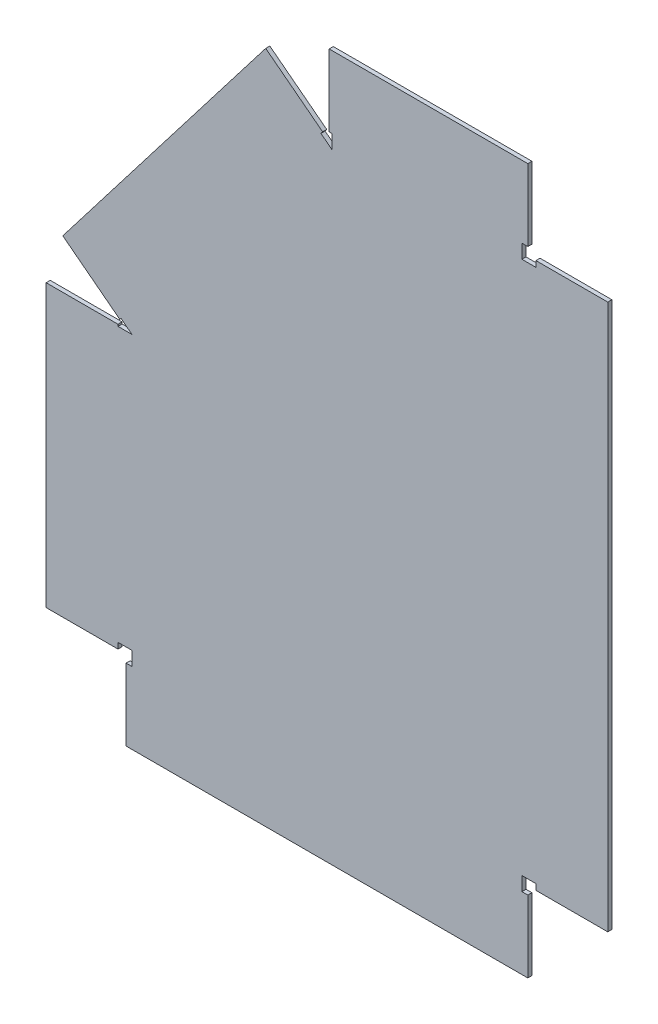
ISO-10303-21;
HEADER;
FILE_DESCRIPTION(('STEP AP214'),'2;1');
FILE_NAME('part.step','',(''),(''),'','','');
FILE_SCHEMA(('AUTOMOTIVE_DESIGN { 1 0 10303 214 1 1 1 1 }'));
ENDSEC;
DATA;
#1=APPLICATION_CONTEXT('core data for automotive mechanical design processes');
#2=APPLICATION_PROTOCOL_DEFINITION('international standard','automotive_design',2000,#1);
#3=PRODUCT_CONTEXT('',#1,'mechanical');
#4=PRODUCT('Part','Part','',(#3));
#5=PRODUCT_RELATED_PRODUCT_CATEGORY('part','',(#4));
#6=PRODUCT_DEFINITION_FORMATION('','',#4);
#7=PRODUCT_DEFINITION_CONTEXT('part definition',#1,'design');
#8=PRODUCT_DEFINITION('design','',#6,#7);
#9=PRODUCT_DEFINITION_SHAPE('','',#8);
#10=(LENGTH_UNIT() NAMED_UNIT(*) SI_UNIT(.MILLI.,.METRE.));
#11=(NAMED_UNIT(*) PLANE_ANGLE_UNIT() SI_UNIT($,.RADIAN.));
#12=(NAMED_UNIT(*) SI_UNIT($,.STERADIAN.) SOLID_ANGLE_UNIT());
#13=UNCERTAINTY_MEASURE_WITH_UNIT(LENGTH_MEASURE(1.E-05),#10,'distance_accuracy_value','');
#14=(GEOMETRIC_REPRESENTATION_CONTEXT(3) GLOBAL_UNCERTAINTY_ASSIGNED_CONTEXT((#13)) GLOBAL_UNIT_ASSIGNED_CONTEXT((#10,
#11,#12)) REPRESENTATION_CONTEXT('',''));
#15=CARTESIAN_POINT('',(0.,0.,0.));
#16=DIRECTION('',(0.,0.,1.));
#17=DIRECTION('',(1.,0.,0.));
#18=AXIS2_PLACEMENT_3D('',#15,#16,#17);
#19=CARTESIAN_POINT('',(0.,2.49999999999999,325.81995012622));
#20=DIRECTION('',(0.,-1.,0.));
#21=DIRECTION('',(0.,0.,-1.));
#22=AXIS2_PLACEMENT_3D('',#19,#20,#21);
#23=PLANE('',#22);
#24=DIRECTION('',(0.,0.,-1.));
#25=VECTOR('',#24,1.);
#26=CARTESIAN_POINT('',(-2.49999999999999,2.49999999999999,325.81995012622));
#27=LINE('',#26,#25);
#28=CARTESIAN_POINT('',(-2.49999999999999,2.49999999999999,1.));
#29=VERTEX_POINT('',#28);
#30=CARTESIAN_POINT('',(-2.49999999999999,2.49999999999999,0.));
#31=VERTEX_POINT('',#30);
#32=EDGE_CURVE('E279',#29,#31,#27,.T.);
#33=ORIENTED_EDGE('',*,*,#32,.T.);
#34=DIRECTION('',(-1.,0.,0.));
#35=VECTOR('',#34,1.);
#36=CARTESIAN_POINT('',(0.,2.49999999999999,0.));
#37=LINE('',#36,#35);
#38=CARTESIAN_POINT('',(0.899999999999991,2.49999999999999,0.));
#39=VERTEX_POINT('',#38);
#40=EDGE_CURVE('E62',#39,#31,#37,.T.);
#41=ORIENTED_EDGE('',*,*,#40,.F.);
#42=DIRECTION('',(0.,0.,-1.));
#43=VECTOR('',#42,1.);
#44=CARTESIAN_POINT('',(0.899999999999975,2.49999999999999,269.144751350765));
#45=LINE('',#44,#43);
#46=CARTESIAN_POINT('',(0.899999999999991,2.49999999999999,1.));
#47=VERTEX_POINT('',#46);
#48=EDGE_CURVE('E463',#47,#39,#45,.T.);
#49=ORIENTED_EDGE('',*,*,#48,.F.);
#50=DIRECTION('',(-1.,0.,0.));
#51=VECTOR('',#50,1.);
#52=CARTESIAN_POINT('',(0.,2.49999999999999,1.));
#53=LINE('',#52,#51);
#54=EDGE_CURVE('E283',#47,#29,#53,.T.);
#55=ORIENTED_EDGE('',*,*,#54,.T.);
#56=EDGE_LOOP('',(#33,#41,#49,#55));
#57=FACE_BOUND('',#56,.T.);
#58=ADVANCED_FACE('F47',(#57),#23,.T.);
#59=CARTESIAN_POINT('',(0.,132.5,325.81995012622));
#60=DIRECTION('',(0.,1.,0.));
#61=DIRECTION('',(0.,0.,1.));
#62=AXIS2_PLACEMENT_3D('',#59,#60,#61);
#63=PLANE('',#62);
#64=DIRECTION('',(1.,0.,0.));
#65=VECTOR('',#64,1.);
#66=CARTESIAN_POINT('',(0.,132.5,1.));
#67=LINE('',#66,#65);
#68=CARTESIAN_POINT('',(-2.49999999999999,132.5,1.));
#69=VERTEX_POINT('',#68);
#70=CARTESIAN_POINT('',(0.89999999999999,132.5,1.));
#71=VERTEX_POINT('',#70);
#72=EDGE_CURVE('E506',#69,#71,#67,.T.);
#73=ORIENTED_EDGE('',*,*,#72,.T.);
#74=DIRECTION('',(0.,0.,-1.));
#75=VECTOR('',#74,1.);
#76=CARTESIAN_POINT('',(0.899999999999973,132.5,269.144751350765));
#77=LINE('',#76,#75);
#78=CARTESIAN_POINT('',(0.89999999999999,132.5,0.));
#79=VERTEX_POINT('',#78);
#80=EDGE_CURVE('E444',#71,#79,#77,.T.);
#81=ORIENTED_EDGE('',*,*,#80,.T.);
#82=DIRECTION('',(1.,0.,0.));
#83=VECTOR('',#82,1.);
#84=CARTESIAN_POINT('',(0.,132.5,0.));
#85=LINE('',#84,#83);
#86=CARTESIAN_POINT('',(-2.49999999999999,132.5,0.));
#87=VERTEX_POINT('',#86);
#88=EDGE_CURVE('E489',#87,#79,#85,.T.);
#89=ORIENTED_EDGE('',*,*,#88,.F.);
#90=DIRECTION('',(0.,0.,-1.));
#91=VECTOR('',#90,1.);
#92=CARTESIAN_POINT('',(-2.49999999999999,132.5,325.81995012622));
#93=LINE('',#92,#91);
#94=EDGE_CURVE('E12',#69,#87,#93,.T.);
#95=ORIENTED_EDGE('',*,*,#94,.F.);
#96=EDGE_LOOP('',(#73,#81,#89,#95));
#97=FACE_BOUND('',#96,.T.);
#98=ADVANCED_FACE('F562',(#97),#63,.T.);
#99=CARTESIAN_POINT('',(-2.49999999999999,0.,325.81995012622));
#100=DIRECTION('',(1.,0.,0.));
#101=DIRECTION('',(0.,0.,-1.));
#102=AXIS2_PLACEMENT_3D('',#99,#100,#101);
#103=PLANE('',#102);
#104=ORIENTED_EDGE('',*,*,#94,.T.);
#105=DIRECTION('',(0.,-1.,0.));
#106=VECTOR('',#105,1.);
#107=CARTESIAN_POINT('',(-2.49999999999999,0.,0.));
#108=LINE('',#107,#106);
#109=CARTESIAN_POINT('',(-2.49999999999999,135.9,0.));
#110=VERTEX_POINT('',#109);
#111=EDGE_CURVE('E447',#110,#87,#108,.T.);
#112=ORIENTED_EDGE('',*,*,#111,.F.);
#113=DIRECTION('',(0.,0.,-1.));
#114=VECTOR('',#113,1.);
#115=CARTESIAN_POINT('',(-2.49999999999999,135.9,104.242165006645));
#116=LINE('',#115,#114);
#117=CARTESIAN_POINT('',(-2.49999999999999,135.9,1.));
#118=VERTEX_POINT('',#117);
#119=EDGE_CURVE('E418',#118,#110,#116,.T.);
#120=ORIENTED_EDGE('',*,*,#119,.F.);
#121=DIRECTION('',(0.,-1.,0.));
#122=VECTOR('',#121,1.);
#123=CARTESIAN_POINT('',(-2.49999999999999,0.,1.));
#124=LINE('',#123,#122);
#125=EDGE_CURVE('E69',#118,#69,#124,.T.);
#126=ORIENTED_EDGE('',*,*,#125,.T.);
#127=EDGE_LOOP('',(#104,#112,#120,#126));
#128=FACE_BOUND('',#127,.T.);
#129=ADVANCED_FACE('F558',(#128),#103,.T.);
#130=CARTESIAN_POINT('',(-48.7689962563738,0.,325.81995012622));
#131=DIRECTION('',(-1.,0.,0.));
#132=DIRECTION('',(0.,0.,1.));
#133=AXIS2_PLACEMENT_3D('',#130,#131,#132);
#134=PLANE('',#133);
#135=DIRECTION('',(0.,1.,0.));
#136=VECTOR('',#135,1.);
#137=CARTESIAN_POINT('',(-48.7689962563738,0.,1.));
#138=LINE('',#137,#136);
#139=CARTESIAN_POINT('',(-48.7689962563738,132.5,1.));
#140=VERTEX_POINT('',#139);
#141=CARTESIAN_POINT('',(-48.7689962563738,135.9,1.));
#142=VERTEX_POINT('',#141);
#143=EDGE_CURVE('E509',#140,#142,#138,.T.);
#144=ORIENTED_EDGE('',*,*,#143,.T.);
#145=DIRECTION('',(0.,0.,-1.));
#146=VECTOR('',#145,1.);
#147=CARTESIAN_POINT('',(-48.7689962563738,135.9,104.242165006645));
#148=LINE('',#147,#146);
#149=CARTESIAN_POINT('',(-48.7689962563738,135.9,0.));
#150=VERTEX_POINT('',#149);
#151=EDGE_CURVE('E397',#142,#150,#148,.T.);
#152=ORIENTED_EDGE('',*,*,#151,.T.);
#153=DIRECTION('',(0.,1.,0.));
#154=VECTOR('',#153,1.);
#155=CARTESIAN_POINT('',(-48.7689962563738,0.,0.));
#156=LINE('',#155,#154);
#157=CARTESIAN_POINT('',(-48.7689962563738,132.5,0.));
#158=VERTEX_POINT('',#157);
#159=EDGE_CURVE('E504',#158,#150,#156,.T.);
#160=ORIENTED_EDGE('',*,*,#159,.F.);
#161=DIRECTION('',(0.,0.,-1.));
#162=VECTOR('',#161,1.);
#163=CARTESIAN_POINT('',(-48.7689962563738,132.5,325.81995012622));
#164=LINE('',#163,#162);
#165=EDGE_CURVE('E55',#140,#158,#164,.T.);
#166=ORIENTED_EDGE('',*,*,#165,.F.);
#167=EDGE_LOOP('',(#144,#152,#160,#166));
#168=FACE_BOUND('',#167,.T.);
#169=ADVANCED_FACE('F536',(#168),#134,.T.);
#170=CARTESIAN_POINT('',(45.9037188638016,59.6748345229422,325.81995012622));
#171=DIRECTION('',(0.609710760849692,0.792623989104601,0.));
#172=DIRECTION('',(-0.792623989104601,0.609710760849692,0.));
#173=AXIS2_PLACEMENT_3D('',#170,#171,#172);
#174=PLANE('',#173);
#175=ORIENTED_EDGE('',*,*,#165,.T.);
#176=DIRECTION('',(0.792623989104601,-0.609710760849692,0.));
#177=VECTOR('',#176,1.);
#178=CARTESIAN_POINT('',(45.9037188638016,59.6748345229422,0.));
#179=LINE('',#178,#177);
#180=CARTESIAN_POINT('',(-51.4639178193294,134.573016586889,0.));
#181=VERTEX_POINT('',#180);
#182=EDGE_CURVE('E502',#181,#158,#179,.T.);
#183=ORIENTED_EDGE('',*,*,#182,.F.);
#184=DIRECTION('',(0.,0.,-1.));
#185=VECTOR('',#184,1.);
#186=CARTESIAN_POINT('',(-51.4639178193294,134.573016586889,197.164597398797));
#187=LINE('',#186,#185);
#188=CARTESIAN_POINT('',(-51.4639178193294,134.573016586889,1.));
#189=VERTEX_POINT('',#188);
#190=EDGE_CURVE('E374',#189,#181,#187,.T.);
#191=ORIENTED_EDGE('',*,*,#190,.F.);
#192=DIRECTION('',(0.792623989104601,-0.609710760849692,0.));
#193=VECTOR('',#192,1.);
#194=CARTESIAN_POINT('',(45.9037188638016,59.6748345229422,1.));
#195=LINE('',#194,#193);
#196=EDGE_CURVE('E511',#189,#140,#195,.T.);
#197=ORIENTED_EDGE('',*,*,#196,.T.);
#198=EDGE_LOOP('',(#175,#183,#191,#197));
#199=FACE_BOUND('',#198,.T.);
#200=ADVANCED_FACE('F530',(#199),#174,.T.);
#201=CARTESIAN_POINT('',(-2.82728487982477,-3.67547034377219,325.81995012622));
#202=DIRECTION('',(-0.609710760849693,-0.7926239891046,0.));
#203=DIRECTION('',(0.7926239891046,-0.609710760849693,0.));
#204=AXIS2_PLACEMENT_3D('',#201,#202,#203);
#205=PLANE('',#204);
#206=DIRECTION('',(-0.7926239891046,0.609710760849693,0.));
#207=VECTOR('',#206,1.);
#208=CARTESIAN_POINT('',(-2.82728487982477,-3.67547034377219,1.));
#209=LINE('',#208,#207);
#210=CARTESIAN_POINT('',(-97.5,69.1496951332858,1.));
#211=VERTEX_POINT('',#210);
#212=CARTESIAN_POINT('',(-100.194921562956,71.2227117201747,0.999999999999945));
#213=VERTEX_POINT('',#212);
#214=EDGE_CURVE('E513',#211,#213,#209,.T.);
#215=ORIENTED_EDGE('',*,*,#214,.T.);
#216=DIRECTION('',(0.,0.,-1.));
#217=VECTOR('',#216,1.);
#218=CARTESIAN_POINT('',(-100.194921562956,71.2227117201746,197.164597398797));
#219=LINE('',#218,#217);
#220=CARTESIAN_POINT('',(-100.194921562956,71.2227117201747,0.));
#221=VERTEX_POINT('',#220);
#222=EDGE_CURVE('E350',#213,#221,#219,.T.);
#223=ORIENTED_EDGE('',*,*,#222,.T.);
#224=DIRECTION('',(-0.7926239891046,0.609710760849693,0.));
#225=VECTOR('',#224,1.);
#226=CARTESIAN_POINT('',(-2.82728487982477,-3.67547034377219,0.));
#227=LINE('',#226,#225);
#228=CARTESIAN_POINT('',(-97.5,69.1496951332858,0.));
#229=VERTEX_POINT('',#228);
#230=EDGE_CURVE('E500',#229,#221,#227,.T.);
#231=ORIENTED_EDGE('',*,*,#230,.F.);
#232=DIRECTION('',(0.,0.,-1.));
#233=VECTOR('',#232,1.);
#234=CARTESIAN_POINT('',(-97.5,69.1496951332858,325.81995012622));
#235=LINE('',#234,#233);
#236=EDGE_CURVE('E525',#211,#229,#235,.T.);
#237=ORIENTED_EDGE('',*,*,#236,.F.);
#238=EDGE_LOOP('',(#215,#223,#231,#237));
#239=FACE_BOUND('',#238,.T.);
#240=ADVANCED_FACE('F596',(#239),#205,.T.);
#241=CARTESIAN_POINT('',(0.,69.1496951332858,325.81995012622));
#242=DIRECTION('',(0.,1.,0.));
#243=DIRECTION('',(0.,0.,1.));
#244=AXIS2_PLACEMENT_3D('',#241,#242,#243);
#245=PLANE('',#244);
#246=ORIENTED_EDGE('',*,*,#236,.T.);
#247=DIRECTION('',(1.,0.,0.));
#248=VECTOR('',#247,1.);
#249=CARTESIAN_POINT('',(0.,69.1496951332858,0.));
#250=LINE('',#249,#248);
#251=CARTESIAN_POINT('',(-100.9,69.1496951332858,0.));
#252=VERTEX_POINT('',#251);
#253=EDGE_CURVE('E498',#252,#229,#250,.T.);
#254=ORIENTED_EDGE('',*,*,#253,.F.);
#255=DIRECTION('',(0.,0.,-1.));
#256=VECTOR('',#255,1.);
#257=CARTESIAN_POINT('',(-100.9,69.1496951332858,142.721302256771));
#258=LINE('',#257,#256);
#259=CARTESIAN_POINT('',(-100.9,69.1496951332858,1.));
#260=VERTEX_POINT('',#259);
#261=EDGE_CURVE('E328',#260,#252,#258,.T.);
#262=ORIENTED_EDGE('',*,*,#261,.F.);
#263=DIRECTION('',(1.,0.,0.));
#264=VECTOR('',#263,1.);
#265=CARTESIAN_POINT('',(0.,69.1496951332858,1.));
#266=LINE('',#265,#264);
#267=EDGE_CURVE('E515',#260,#211,#266,.T.);
#268=ORIENTED_EDGE('',*,*,#267,.T.);
#269=EDGE_LOOP('',(#246,#254,#262,#268));
#270=FACE_BOUND('',#269,.T.);
#271=ADVANCED_FACE('F599',(#270),#245,.T.);
#272=CARTESIAN_POINT('',(0.,2.49999999999999,325.81995012622));
#273=DIRECTION('',(0.,-1.,0.));
#274=DIRECTION('',(0.,0.,-1.));
#275=AXIS2_PLACEMENT_3D('',#272,#273,#274);
#276=PLANE('',#275);
#277=DIRECTION('',(-1.,0.,0.));
#278=VECTOR('',#277,1.);
#279=CARTESIAN_POINT('',(0.,2.49999999999999,1.));
#280=LINE('',#279,#278);
#281=CARTESIAN_POINT('',(-97.5,2.49999999999999,1.));
#282=VERTEX_POINT('',#281);
#283=CARTESIAN_POINT('',(-100.9,2.49999999999999,1.));
#284=VERTEX_POINT('',#283);
#285=EDGE_CURVE('E517',#282,#284,#280,.T.);
#286=ORIENTED_EDGE('',*,*,#285,.T.);
#287=DIRECTION('',(0.,0.,-1.));
#288=VECTOR('',#287,1.);
#289=CARTESIAN_POINT('',(-100.9,2.49999999999999,142.721302256771));
#290=LINE('',#289,#288);
#291=CARTESIAN_POINT('',(-100.9,2.49999999999999,0.));
#292=VERTEX_POINT('',#291);
#293=EDGE_CURVE('E305',#284,#292,#290,.T.);
#294=ORIENTED_EDGE('',*,*,#293,.T.);
#295=DIRECTION('',(-1.,0.,0.));
#296=VECTOR('',#295,1.);
#297=CARTESIAN_POINT('',(0.,2.49999999999999,0.));
#298=LINE('',#297,#296);
#299=CARTESIAN_POINT('',(-97.5,2.49999999999999,0.));
#300=VERTEX_POINT('',#299);
#301=EDGE_CURVE('E496',#300,#292,#298,.T.);
#302=ORIENTED_EDGE('',*,*,#301,.F.);
#303=DIRECTION('',(0.,0.,-1.));
#304=VECTOR('',#303,1.);
#305=CARTESIAN_POINT('',(-97.5,2.49999999999999,325.81995012622));
#306=LINE('',#305,#304);
#307=EDGE_CURVE('E522',#282,#300,#306,.T.);
#308=ORIENTED_EDGE('',*,*,#307,.F.);
#309=EDGE_LOOP('',(#286,#294,#302,#308));
#310=FACE_BOUND('',#309,.T.);
#311=ADVANCED_FACE('F603',(#310),#276,.T.);
#312=CARTESIAN_POINT('',(-97.5,0.,325.81995012622));
#313=DIRECTION('',(-1.,0.,0.));
#314=DIRECTION('',(0.,0.,1.));
#315=AXIS2_PLACEMENT_3D('',#312,#313,#314);
#316=PLANE('',#315);
#317=ORIENTED_EDGE('',*,*,#307,.T.);
#318=DIRECTION('',(0.,1.,0.));
#319=VECTOR('',#318,1.);
#320=CARTESIAN_POINT('',(-97.5,0.,0.));
#321=LINE('',#320,#319);
#322=CARTESIAN_POINT('',(-97.5,-0.899999999999991,0.));
#323=VERTEX_POINT('',#322);
#324=EDGE_CURVE('E494',#323,#300,#321,.T.);
#325=ORIENTED_EDGE('',*,*,#324,.F.);
#326=DIRECTION('',(0.,0.,-1.));
#327=VECTOR('',#326,1.);
#328=CARTESIAN_POINT('',(-97.5,-0.899999999999979,200.000516724731));
#329=LINE('',#328,#327);
#330=CARTESIAN_POINT('',(-97.5,-0.899999999999991,1.));
#331=VERTEX_POINT('',#330);
#332=EDGE_CURVE('E1126',#331,#323,#329,.T.);
#333=ORIENTED_EDGE('',*,*,#332,.F.);
#334=DIRECTION('',(0.,1.,0.));
#335=VECTOR('',#334,1.);
#336=CARTESIAN_POINT('',(-97.5,0.,1.));
#337=LINE('',#336,#335);
#338=EDGE_CURVE('E284',#331,#282,#337,.T.);
#339=ORIENTED_EDGE('',*,*,#338,.T.);
#340=EDGE_LOOP('',(#317,#325,#333,#339));
#341=FACE_BOUND('',#340,.T.);
#342=ADVANCED_FACE('F607',(#341),#316,.T.);
#343=CARTESIAN_POINT('',(-2.49999999999999,0.,325.81995012622));
#344=DIRECTION('',(1.,0.,0.));
#345=DIRECTION('',(0.,0.,-1.));
#346=AXIS2_PLACEMENT_3D('',#343,#344,#345);
#347=PLANE('',#346);
#348=DIRECTION('',(0.,-1.,0.));
#349=VECTOR('',#348,1.);
#350=CARTESIAN_POINT('',(-2.49999999999999,0.,1.));
#351=LINE('',#350,#349);
#352=CARTESIAN_POINT('',(-2.49999999999999,-0.899999999999991,1.));
#353=VERTEX_POINT('',#352);
#354=EDGE_CURVE('E274',#29,#353,#351,.T.);
#355=ORIENTED_EDGE('',*,*,#354,.T.);
#356=DIRECTION('',(0.,0.,-1.));
#357=VECTOR('',#356,1.);
#358=CARTESIAN_POINT('',(-2.49999999999999,-0.899999999999979,200.000516724731));
#359=LINE('',#358,#357);
#360=CARTESIAN_POINT('',(-2.49999999999999,-0.899999999999991,0.));
#361=VERTEX_POINT('',#360);
#362=EDGE_CURVE('E277',#353,#361,#359,.T.);
#363=ORIENTED_EDGE('',*,*,#362,.T.);
#364=DIRECTION('',(0.,-1.,0.));
#365=VECTOR('',#364,1.);
#366=CARTESIAN_POINT('',(-2.49999999999999,0.,0.));
#367=LINE('',#366,#365);
#368=EDGE_CURVE('E492',#31,#361,#367,.T.);
#369=ORIENTED_EDGE('',*,*,#368,.F.);
#370=ORIENTED_EDGE('',*,*,#32,.F.);
#371=EDGE_LOOP('',(#355,#363,#369,#370));
#372=FACE_BOUND('',#371,.T.);
#373=ADVANCED_FACE('F276',(#372),#347,.T.);
#374=CARTESIAN_POINT('',(0.,0.,1.));
#375=DIRECTION('',(0.,0.,-1.));
#376=DIRECTION('',(-1.,0.,0.));
#377=AXIS2_PLACEMENT_3D('',#374,#375,#376);
#378=PLANE('',#377);
#379=ORIENTED_EDGE('',*,*,#54,.F.);
#380=DIRECTION('',(0.,1.,0.));
#381=VECTOR('',#380,1.);
#382=CARTESIAN_POINT('',(0.899999999999989,135.,1.));
#383=LINE('',#382,#381);
#384=CARTESIAN_POINT('',(0.899999999999993,1.07071067811865,1.));
#385=VERTEX_POINT('',#384);
#386=EDGE_CURVE('E466',#385,#47,#383,.T.);
#387=ORIENTED_EDGE('',*,*,#386,.F.);
#388=DIRECTION('',(1.,0.,0.));
#389=VECTOR('',#388,1.);
#390=CARTESIAN_POINT('',(18.4,1.07071067811865,1.));
#391=LINE('',#390,#389);
#392=CARTESIAN_POINT('',(18.4,1.07071067811865,1.));
#393=VERTEX_POINT('',#392);
#394=EDGE_CURVE('E460',#385,#393,#391,.T.);
#395=ORIENTED_EDGE('',*,*,#394,.T.);
#396=DIRECTION('',(0.,1.,0.));
#397=VECTOR('',#396,1.);
#398=CARTESIAN_POINT('',(18.4,0.,1.));
#399=LINE('',#398,#397);
#400=CARTESIAN_POINT('',(18.4,133.929289321881,1.));
#401=VERTEX_POINT('',#400);
#402=EDGE_CURVE('E457',#393,#401,#399,.T.);
#403=ORIENTED_EDGE('',*,*,#402,.T.);
#404=DIRECTION('',(-1.,0.,0.));
#405=VECTOR('',#404,1.);
#406=CARTESIAN_POINT('',(18.4,133.929289321881,1.));
#407=LINE('',#406,#405);
#408=CARTESIAN_POINT('',(0.899999999999989,133.929289321881,1.));
#409=VERTEX_POINT('',#408);
#410=EDGE_CURVE('E454',#401,#409,#407,.T.);
#411=ORIENTED_EDGE('',*,*,#410,.T.);
#412=DIRECTION('',(0.,1.,0.));
#413=VECTOR('',#412,1.);
#414=CARTESIAN_POINT('',(0.899999999999989,135.,1.));
#415=LINE('',#414,#413);
#416=EDGE_CURVE('E400',#71,#409,#415,.T.);
#417=ORIENTED_EDGE('',*,*,#416,.F.);
#418=ORIENTED_EDGE('',*,*,#72,.F.);
#419=ORIENTED_EDGE('',*,*,#125,.F.);
#420=DIRECTION('',(-1.,0.,0.));
#421=VECTOR('',#420,1.);
#422=CARTESIAN_POINT('',(-50.,135.9,1.));
#423=LINE('',#422,#421);
#424=CARTESIAN_POINT('',(-1.07071067811866,135.9,1.));
#425=VERTEX_POINT('',#424);
#426=EDGE_CURVE('E421',#425,#118,#423,.T.);
#427=ORIENTED_EDGE('',*,*,#426,.F.);
#428=DIRECTION('',(0.,1.,0.));
#429=VECTOR('',#428,1.);
#430=CARTESIAN_POINT('',(-1.07071067811865,153.4,1.));
#431=LINE('',#430,#429);
#432=CARTESIAN_POINT('',(-1.07071067811866,153.4,1.));
#433=VERTEX_POINT('',#432);
#434=EDGE_CURVE('E415',#425,#433,#431,.T.);
#435=ORIENTED_EDGE('',*,*,#434,.T.);
#436=DIRECTION('',(-1.,0.,0.));
#437=VECTOR('',#436,1.);
#438=CARTESIAN_POINT('',(0.,153.4,1.));
#439=LINE('',#438,#437);
#440=CARTESIAN_POINT('',(-49.45186567482,153.4,1.));
#441=VERTEX_POINT('',#440);
#442=EDGE_CURVE('E412',#433,#441,#439,.T.);
#443=ORIENTED_EDGE('',*,*,#442,.T.);
#444=DIRECTION('',(0.,-1.,0.));
#445=VECTOR('',#444,1.);
#446=CARTESIAN_POINT('',(-49.45186567482,153.4,1.));
#447=LINE('',#446,#445);
#448=CARTESIAN_POINT('',(-49.45186567482,135.9,1.));
#449=VERTEX_POINT('',#448);
#450=EDGE_CURVE('E409',#441,#449,#447,.T.);
#451=ORIENTED_EDGE('',*,*,#450,.T.);
#452=DIRECTION('',(1.,0.,0.));
#453=VECTOR('',#452,1.);
#454=CARTESIAN_POINT('',(-50.,135.9,1.));
#455=LINE('',#454,#453);
#456=EDGE_CURVE('E406',#449,#142,#455,.T.);
#457=ORIENTED_EDGE('',*,*,#456,.T.);
#458=ORIENTED_EDGE('',*,*,#143,.F.);
#459=ORIENTED_EDGE('',*,*,#196,.F.);
#460=DIRECTION('',(0.609710760849692,0.792623989104601,0.));
#461=VECTOR('',#460,1.);
#462=CARTESIAN_POINT('',(-100.713361590194,70.5487396847647,0.999999999999973));
#463=LINE('',#462,#461);
#464=CARTESIAN_POINT('',(-51.0475649866475,135.114275269375,0.999999999999973));
#465=VERTEX_POINT('',#464);
#466=EDGE_CURVE('E368',#189,#465,#463,.T.);
#467=ORIENTED_EDGE('',*,*,#466,.T.);
#468=DIRECTION('',(-0.792623989104601,0.609710760849692,0.));
#469=VECTOR('',#468,1.);
#470=CARTESIAN_POINT('',(-64.918484795978,145.784213584245,1.));
#471=LINE('',#470,#469);
#472=CARTESIAN_POINT('',(-64.918484795978,145.784213584245,0.999999999999987));
#473=VERTEX_POINT('',#472);
#474=EDGE_CURVE('E365',#465,#473,#471,.T.);
#475=ORIENTED_EDGE('',*,*,#474,.T.);
#476=DIRECTION('',(-0.609710760849692,-0.792623989104601,0.));
#477=VECTOR('',#476,1.);
#478=CARTESIAN_POINT('',(-111.238556492461,85.5681203788165,0.999999999999973));
#479=LINE('',#478,#477);
#480=CARTESIAN_POINT('',(-114.344704766671,81.5301276223436,0.999999999999959));
#481=VERTEX_POINT('',#480);
#482=EDGE_CURVE('E362',#473,#481,#479,.T.);
#483=ORIENTED_EDGE('',*,*,#482,.T.);
#484=DIRECTION('',(0.792623989104601,-0.609710760849692,0.));
#485=VECTOR('',#484,1.);
#486=CARTESIAN_POINT('',(-114.344704766671,81.5301276223436,0.999999999999945));
#487=LINE('',#486,#485);
#488=CARTESIAN_POINT('',(-100.473784957341,70.860189307474,0.999999999999973));
#489=VERTEX_POINT('',#488);
#490=EDGE_CURVE('E359',#481,#489,#487,.T.);
#491=ORIENTED_EDGE('',*,*,#490,.T.);
#492=DIRECTION('',(0.609710760849692,0.792623989104601,0.));
#493=VECTOR('',#492,1.);
#494=CARTESIAN_POINT('',(-100.713361590194,70.5487396847647,0.999999999999973));
#495=LINE('',#494,#493);
#496=EDGE_CURVE('E356',#489,#213,#495,.T.);
#497=ORIENTED_EDGE('',*,*,#496,.T.);
#498=ORIENTED_EDGE('',*,*,#214,.F.);
#499=ORIENTED_EDGE('',*,*,#267,.F.);
#500=DIRECTION('',(0.,1.,0.));
#501=VECTOR('',#500,1.);
#502=CARTESIAN_POINT('',(-100.9,0.,1.));
#503=LINE('',#502,#501);
#504=CARTESIAN_POINT('',(-100.9,69.6070651065442,1.));
#505=VERTEX_POINT('',#504);
#506=EDGE_CURVE('E322',#260,#505,#503,.T.);
#507=ORIENTED_EDGE('',*,*,#506,.T.);
#508=DIRECTION('',(-1.,0.,0.));
#509=VECTOR('',#508,1.);
#510=CARTESIAN_POINT('',(-118.4,69.6070651065442,0.999999999999987));
#511=LINE('',#510,#509);
#512=CARTESIAN_POINT('',(-118.4,69.6070651065442,0.999999999999987));
#513=VERTEX_POINT('',#512);
#514=EDGE_CURVE('E319',#505,#513,#511,.T.);
#515=ORIENTED_EDGE('',*,*,#514,.T.);
#516=DIRECTION('',(0.,-1.,0.));
#517=VECTOR('',#516,1.);
#518=CARTESIAN_POINT('',(-118.4,0.,0.999999999999987));
#519=LINE('',#518,#517);
#520=CARTESIAN_POINT('',(-118.4,1.07071067811865,0.999999999999987));
#521=VERTEX_POINT('',#520);
#522=EDGE_CURVE('E316',#513,#521,#519,.T.);
#523=ORIENTED_EDGE('',*,*,#522,.T.);
#524=DIRECTION('',(1.,0.,0.));
#525=VECTOR('',#524,1.);
#526=CARTESIAN_POINT('',(-118.4,1.07071067811865,0.999999999999987));
#527=LINE('',#526,#525);
#528=CARTESIAN_POINT('',(-100.9,1.07071067811865,1.));
#529=VERTEX_POINT('',#528);
#530=EDGE_CURVE('E313',#521,#529,#527,.T.);
#531=ORIENTED_EDGE('',*,*,#530,.T.);
#532=DIRECTION('',(0.,-1.,0.));
#533=VECTOR('',#532,1.);
#534=CARTESIAN_POINT('',(-100.9,0.,1.));
#535=LINE('',#534,#533);
#536=EDGE_CURVE('E293',#284,#529,#535,.T.);
#537=ORIENTED_EDGE('',*,*,#536,.F.);
#538=ORIENTED_EDGE('',*,*,#285,.F.);
#539=ORIENTED_EDGE('',*,*,#338,.F.);
#540=DIRECTION('',(1.,0.,0.));
#541=VECTOR('',#540,1.);
#542=CARTESIAN_POINT('',(0.,-0.89999999999999,1.));
#543=LINE('',#542,#541);
#544=CARTESIAN_POINT('',(-98.9292893218813,-0.899999999999993,1.));
#545=VERTEX_POINT('',#544);
#546=EDGE_CURVE('E1123',#545,#331,#543,.T.);
#547=ORIENTED_EDGE('',*,*,#546,.F.);
#548=DIRECTION('',(0.,-1.,0.));
#549=VECTOR('',#548,1.);
#550=CARTESIAN_POINT('',(-98.9292893218813,-18.4,1.));
#551=LINE('',#550,#549);
#552=CARTESIAN_POINT('',(-98.9292893218813,-18.4,1.));
#553=VERTEX_POINT('',#552);
#554=EDGE_CURVE('E1129',#545,#553,#551,.T.);
#555=ORIENTED_EDGE('',*,*,#554,.T.);
#556=DIRECTION('',(1.,0.,0.));
#557=VECTOR('',#556,1.);
#558=CARTESIAN_POINT('',(0.,-18.4,1.));
#559=LINE('',#558,#557);
#560=CARTESIAN_POINT('',(-1.07071067811865,-18.4,1.));
#561=VERTEX_POINT('',#560);
#562=EDGE_CURVE('E1132',#553,#561,#559,.T.);
#563=ORIENTED_EDGE('',*,*,#562,.T.);
#564=DIRECTION('',(0.,1.,0.));
#565=VECTOR('',#564,1.);
#566=CARTESIAN_POINT('',(-1.07071067811865,-18.4,1.));
#567=LINE('',#566,#565);
#568=CARTESIAN_POINT('',(-1.07071067811865,-0.899999999999993,1.));
#569=VERTEX_POINT('',#568);
#570=EDGE_CURVE('E298',#561,#569,#567,.T.);
#571=ORIENTED_EDGE('',*,*,#570,.T.);
#572=DIRECTION('',(1.,0.,0.));
#573=VECTOR('',#572,1.);
#574=CARTESIAN_POINT('',(0.,-0.89999999999999,1.));
#575=LINE('',#574,#573);
#576=EDGE_CURVE('E290',#353,#569,#575,.T.);
#577=ORIENTED_EDGE('',*,*,#576,.F.);
#578=ORIENTED_EDGE('',*,*,#354,.F.);
#579=EDGE_LOOP('',(#379,#387,#395,#403,#411,#417,#418,#419,#427,#435,#443,#451,#457,#458,#459,
#467,#475,#483,#491,#497,#498,#499,#507,#515,#523,#531,#537,#538,#539,#547,#555,#563,#571,#577,#578));
#580=FACE_BOUND('',#579,.T.);
#581=ADVANCED_FACE('F49',(#580),#378,.F.);
#582=CARTESIAN_POINT('',(0.,0.,0.));
#583=DIRECTION('',(0.,0.,-1.));
#584=DIRECTION('',(-1.,0.,0.));
#585=AXIS2_PLACEMENT_3D('',#582,#583,#584);
#586=PLANE('',#585);
#587=ORIENTED_EDGE('',*,*,#88,.T.);
#588=DIRECTION('',(0.,1.,0.));
#589=VECTOR('',#588,1.);
#590=CARTESIAN_POINT('',(0.899999999999989,135.,0.));
#591=LINE('',#590,#589);
#592=CARTESIAN_POINT('',(0.899999999999989,133.929289321881,0.));
#593=VERTEX_POINT('',#592);
#594=EDGE_CURVE('E452',#79,#593,#591,.T.);
#595=ORIENTED_EDGE('',*,*,#594,.T.);
#596=DIRECTION('',(-1.,0.,0.));
#597=VECTOR('',#596,1.);
#598=CARTESIAN_POINT('',(29.9,133.929289321881,0.));
#599=LINE('',#598,#597);
#600=CARTESIAN_POINT('',(18.4,133.929289321881,0.));
#601=VERTEX_POINT('',#600);
#602=EDGE_CURVE('E478',#601,#593,#599,.T.);
#603=ORIENTED_EDGE('',*,*,#602,.F.);
#604=DIRECTION('',(0.,1.,0.));
#605=VECTOR('',#604,1.);
#606=CARTESIAN_POINT('',(18.4,135.,0.));
#607=LINE('',#606,#605);
#608=CARTESIAN_POINT('',(18.4,1.07071067811865,0.));
#609=VERTEX_POINT('',#608);
#610=EDGE_CURVE('E472',#609,#601,#607,.T.);
#611=ORIENTED_EDGE('',*,*,#610,.F.);
#612=DIRECTION('',(-1.,0.,0.));
#613=VECTOR('',#612,1.);
#614=CARTESIAN_POINT('',(29.9,1.07071067811865,0.));
#615=LINE('',#614,#613);
#616=CARTESIAN_POINT('',(0.899999999999993,1.07071067811865,0.));
#617=VERTEX_POINT('',#616);
#618=EDGE_CURVE('E450',#609,#617,#615,.T.);
#619=ORIENTED_EDGE('',*,*,#618,.T.);
#620=DIRECTION('',(0.,1.,0.));
#621=VECTOR('',#620,1.);
#622=CARTESIAN_POINT('',(0.899999999999989,135.,0.));
#623=LINE('',#622,#621);
#624=EDGE_CURVE('E448',#617,#39,#623,.T.);
#625=ORIENTED_EDGE('',*,*,#624,.T.);
#626=ORIENTED_EDGE('',*,*,#40,.T.);
#627=ORIENTED_EDGE('',*,*,#368,.T.);
#628=DIRECTION('',(1.,0.,0.));
#629=VECTOR('',#628,1.);
#630=CARTESIAN_POINT('',(0.,-0.899999999999989,0.));
#631=LINE('',#630,#629);
#632=CARTESIAN_POINT('',(-1.07071067811865,-0.899999999999993,0.));
#633=VERTEX_POINT('',#632);
#634=EDGE_CURVE('E292',#361,#633,#631,.T.);
#635=ORIENTED_EDGE('',*,*,#634,.T.);
#636=DIRECTION('',(0.,1.,0.));
#637=VECTOR('',#636,1.);
#638=CARTESIAN_POINT('',(-1.07071067811865,-29.9,0.));
#639=LINE('',#638,#637);
#640=CARTESIAN_POINT('',(-1.07071067811865,-18.4,0.));
#641=VERTEX_POINT('',#640);
#642=EDGE_CURVE('E1111',#641,#633,#639,.T.);
#643=ORIENTED_EDGE('',*,*,#642,.F.);
#644=DIRECTION('',(1.,0.,0.));
#645=VECTOR('',#644,1.);
#646=CARTESIAN_POINT('',(0.,-18.4,0.));
#647=LINE('',#646,#645);
#648=CARTESIAN_POINT('',(-98.9292893218813,-18.4,0.));
#649=VERTEX_POINT('',#648);
#650=EDGE_CURVE('E1118',#649,#641,#647,.T.);
#651=ORIENTED_EDGE('',*,*,#650,.F.);
#652=DIRECTION('',(0.,1.,0.));
#653=VECTOR('',#652,1.);
#654=CARTESIAN_POINT('',(-98.9292893218813,-29.9,0.));
#655=LINE('',#654,#653);
#656=CARTESIAN_POINT('',(-98.9292893218813,-0.899999999999993,0.));
#657=VERTEX_POINT('',#656);
#658=EDGE_CURVE('E1136',#649,#657,#655,.T.);
#659=ORIENTED_EDGE('',*,*,#658,.T.);
#660=DIRECTION('',(1.,0.,0.));
#661=VECTOR('',#660,1.);
#662=CARTESIAN_POINT('',(0.,-0.899999999999989,0.));
#663=LINE('',#662,#661);
#664=EDGE_CURVE('E294',#657,#323,#663,.T.);
#665=ORIENTED_EDGE('',*,*,#664,.T.);
#666=ORIENTED_EDGE('',*,*,#324,.T.);
#667=ORIENTED_EDGE('',*,*,#301,.T.);
#668=DIRECTION('',(0.,-1.,0.));
#669=VECTOR('',#668,1.);
#670=CARTESIAN_POINT('',(-100.9,0.,0.));
#671=LINE('',#670,#669);
#672=CARTESIAN_POINT('',(-100.9,1.07071067811865,0.));
#673=VERTEX_POINT('',#672);
#674=EDGE_CURVE('E311',#292,#673,#671,.T.);
#675=ORIENTED_EDGE('',*,*,#674,.T.);
#676=DIRECTION('',(1.,0.,0.));
#677=VECTOR('',#676,1.);
#678=CARTESIAN_POINT('',(-129.9,1.07071067811865,0.));
#679=LINE('',#678,#677);
#680=CARTESIAN_POINT('',(-118.4,1.07071067811865,0.));
#681=VERTEX_POINT('',#680);
#682=EDGE_CURVE('E340',#681,#673,#679,.T.);
#683=ORIENTED_EDGE('',*,*,#682,.F.);
#684=DIRECTION('',(0.,-1.,0.));
#685=VECTOR('',#684,1.);
#686=CARTESIAN_POINT('',(-118.4,0.,0.));
#687=LINE('',#686,#685);
#688=CARTESIAN_POINT('',(-118.4,69.6070651065442,0.));
#689=VERTEX_POINT('',#688);
#690=EDGE_CURVE('E334',#689,#681,#687,.T.);
#691=ORIENTED_EDGE('',*,*,#690,.F.);
#692=DIRECTION('',(1.,0.,0.));
#693=VECTOR('',#692,1.);
#694=CARTESIAN_POINT('',(-129.9,69.6070651065442,0.));
#695=LINE('',#694,#693);
#696=CARTESIAN_POINT('',(-100.9,69.6070651065442,0.));
#697=VERTEX_POINT('',#696);
#698=EDGE_CURVE('E309',#689,#697,#695,.T.);
#699=ORIENTED_EDGE('',*,*,#698,.T.);
#700=DIRECTION('',(0.,1.,0.));
#701=VECTOR('',#700,1.);
#702=CARTESIAN_POINT('',(-100.9,0.,0.));
#703=LINE('',#702,#701);
#704=EDGE_CURVE('E325',#252,#697,#703,.T.);
#705=ORIENTED_EDGE('',*,*,#704,.F.);
#706=ORIENTED_EDGE('',*,*,#253,.T.);
#707=ORIENTED_EDGE('',*,*,#230,.T.);
#708=DIRECTION('',(0.609710760849692,0.792623989104601,0.));
#709=VECTOR('',#708,1.);
#710=CARTESIAN_POINT('',(-100.713361590194,70.5487396847647,0.));
#711=LINE('',#710,#709);
#712=CARTESIAN_POINT('',(-100.473784957341,70.860189307474,0.));
#713=VERTEX_POINT('',#712);
#714=EDGE_CURVE('E392',#713,#221,#711,.T.);
#715=ORIENTED_EDGE('',*,*,#714,.F.);
#716=DIRECTION('',(0.792623989104601,-0.609710760849692,0.));
#717=VECTOR('',#716,1.);
#718=CARTESIAN_POINT('',(-123.459880641374,88.5418013721151,0.));
#719=LINE('',#718,#717);
#720=CARTESIAN_POINT('',(-114.344704766671,81.5301276223437,0.));
#721=VERTEX_POINT('',#720);
#722=EDGE_CURVE('E386',#721,#713,#719,.T.);
#723=ORIENTED_EDGE('',*,*,#722,.F.);
#724=DIRECTION('',(-0.609710760849692,-0.792623989104601,0.));
#725=VECTOR('',#724,1.);
#726=CARTESIAN_POINT('',(-114.584281399525,81.2186779996343,0.));
#727=LINE('',#726,#725);
#728=CARTESIAN_POINT('',(-64.918484795978,145.784213584245,0.));
#729=VERTEX_POINT('',#728);
#730=EDGE_CURVE('E380',#729,#721,#727,.T.);
#731=ORIENTED_EDGE('',*,*,#730,.F.);
#732=DIRECTION('',(0.792623989104601,-0.609710760849692,0.));
#733=VECTOR('',#732,1.);
#734=CARTESIAN_POINT('',(-74.0336606706809,152.795887334016,0.));
#735=LINE('',#734,#733);
#736=CARTESIAN_POINT('',(-51.0475649866475,135.114275269375,0.));
#737=VERTEX_POINT('',#736);
#738=EDGE_CURVE('E354',#729,#737,#735,.T.);
#739=ORIENTED_EDGE('',*,*,#738,.T.);
#740=DIRECTION('',(0.609710760849692,0.792623989104601,0.));
#741=VECTOR('',#740,1.);
#742=CARTESIAN_POINT('',(-100.713361590194,70.5487396847647,0.));
#743=LINE('',#742,#741);
#744=EDGE_CURVE('E371',#181,#737,#743,.T.);
#745=ORIENTED_EDGE('',*,*,#744,.F.);
#746=ORIENTED_EDGE('',*,*,#182,.T.);
#747=ORIENTED_EDGE('',*,*,#159,.T.);
#748=DIRECTION('',(1.,0.,0.));
#749=VECTOR('',#748,1.);
#750=CARTESIAN_POINT('',(-50.,135.9,0.));
#751=LINE('',#750,#749);
#752=CARTESIAN_POINT('',(-49.45186567482,135.9,0.));
#753=VERTEX_POINT('',#752);
#754=EDGE_CURVE('E439',#753,#150,#751,.T.);
#755=ORIENTED_EDGE('',*,*,#754,.F.);
#756=DIRECTION('',(0.,-1.,0.));
#757=VECTOR('',#756,1.);
#758=CARTESIAN_POINT('',(-49.45186567482,164.9,0.));
#759=LINE('',#758,#757);
#760=CARTESIAN_POINT('',(-49.45186567482,153.4,0.));
#761=VERTEX_POINT('',#760);
#762=EDGE_CURVE('E433',#761,#753,#759,.T.);
#763=ORIENTED_EDGE('',*,*,#762,.F.);
#764=DIRECTION('',(-1.,0.,0.));
#765=VECTOR('',#764,1.);
#766=CARTESIAN_POINT('',(-50.,153.4,0.));
#767=LINE('',#766,#765);
#768=CARTESIAN_POINT('',(-1.07071067811866,153.4,0.));
#769=VERTEX_POINT('',#768);
#770=EDGE_CURVE('E427',#769,#761,#767,.T.);
#771=ORIENTED_EDGE('',*,*,#770,.F.);
#772=DIRECTION('',(0.,-1.,0.));
#773=VECTOR('',#772,1.);
#774=CARTESIAN_POINT('',(-1.07071067811866,164.9,0.));
#775=LINE('',#774,#773);
#776=CARTESIAN_POINT('',(-1.07071067811866,135.9,0.));
#777=VERTEX_POINT('',#776);
#778=EDGE_CURVE('E404',#769,#777,#775,.T.);
#779=ORIENTED_EDGE('',*,*,#778,.T.);
#780=DIRECTION('',(-1.,0.,0.));
#781=VECTOR('',#780,1.);
#782=CARTESIAN_POINT('',(-50.,135.9,0.));
#783=LINE('',#782,#781);
#784=EDGE_CURVE('E401',#777,#110,#783,.T.);
#785=ORIENTED_EDGE('',*,*,#784,.T.);
#786=ORIENTED_EDGE('',*,*,#111,.T.);
#787=EDGE_LOOP('',(#587,#595,#603,#611,#619,#625,#626,#627,#635,#643,#651,#659,#665,#666,#667,
#675,#683,#691,#699,#705,#706,#707,#715,#723,#731,#739,#745,#746,#747,#755,#763,#771,#779,#785,#786));
#788=FACE_BOUND('',#787,.T.);
#789=ADVANCED_FACE('F545',(#788),#586,.T.);
#790=CARTESIAN_POINT('',(0.899999999999972,135.,269.144751350765));
#791=DIRECTION('',(-1.,0.,0.));
#792=DIRECTION('',(0.,0.,1.));
#793=AXIS2_PLACEMENT_3D('',#790,#791,#792);
#794=PLANE('',#793);
#795=ORIENTED_EDGE('',*,*,#594,.F.);
#796=ORIENTED_EDGE('',*,*,#80,.F.);
#797=ORIENTED_EDGE('',*,*,#416,.T.);
#798=DIRECTION('',(0.,0.,-1.));
#799=VECTOR('',#798,1.);
#800=CARTESIAN_POINT('',(0.899999999999972,133.929289321881,269.144751350765));
#801=LINE('',#800,#799);
#802=EDGE_CURVE('E484',#409,#593,#801,.T.);
#803=ORIENTED_EDGE('',*,*,#802,.T.);
#804=EDGE_LOOP('',(#795,#796,#797,#803));
#805=FACE_BOUND('',#804,.T.);
#806=ADVANCED_FACE('F566',(#805),#794,.T.);
#807=CARTESIAN_POINT('',(18.4,133.929289321881,269.144751350765));
#808=DIRECTION('',(0.,-1.,0.));
#809=DIRECTION('',(1.,0.,0.));
#810=AXIS2_PLACEMENT_3D('',#807,#808,#809);
#811=PLANE('',#810);
#812=DIRECTION('',(0.,0.,-1.));
#813=VECTOR('',#812,1.);
#814=CARTESIAN_POINT('',(18.4,133.929289321881,269.144751350765));
#815=LINE('',#814,#813);
#816=EDGE_CURVE('E481',#401,#601,#815,.T.);
#817=ORIENTED_EDGE('',*,*,#816,.T.);
#818=ORIENTED_EDGE('',*,*,#602,.T.);
#819=ORIENTED_EDGE('',*,*,#802,.F.);
#820=ORIENTED_EDGE('',*,*,#410,.F.);
#821=EDGE_LOOP('',(#817,#818,#819,#820));
#822=FACE_BOUND('',#821,.T.);
#823=ADVANCED_FACE('F570',(#822),#811,.F.);
#824=CARTESIAN_POINT('',(18.4,0.,269.144751350765));
#825=DIRECTION('',(-1.,0.,0.));
#826=DIRECTION('',(0.,0.,1.));
#827=AXIS2_PLACEMENT_3D('',#824,#825,#826);
#828=PLANE('',#827);
#829=DIRECTION('',(0.,0.,-1.));
#830=VECTOR('',#829,1.);
#831=CARTESIAN_POINT('',(18.4,1.07071067811865,269.144751350765));
#832=LINE('',#831,#830);
#833=EDGE_CURVE('E475',#393,#609,#832,.T.);
#834=ORIENTED_EDGE('',*,*,#833,.T.);
#835=ORIENTED_EDGE('',*,*,#610,.T.);
#836=ORIENTED_EDGE('',*,*,#816,.F.);
#837=ORIENTED_EDGE('',*,*,#402,.F.);
#838=EDGE_LOOP('',(#834,#835,#836,#837));
#839=FACE_BOUND('',#838,.T.);
#840=ADVANCED_FACE('F572',(#839),#828,.F.);
#841=CARTESIAN_POINT('',(18.4,1.07071067811865,269.144751350765));
#842=DIRECTION('',(0.,1.,0.));
#843=DIRECTION('',(-1.,0.,0.));
#844=AXIS2_PLACEMENT_3D('',#841,#842,#843);
#845=PLANE('',#844);
#846=DIRECTION('',(0.,0.,-1.));
#847=VECTOR('',#846,1.);
#848=CARTESIAN_POINT('',(0.899999999999976,1.07071067811865,269.144751350765));
#849=LINE('',#848,#847);
#850=EDGE_CURVE('E469',#385,#617,#849,.T.);
#851=ORIENTED_EDGE('',*,*,#850,.T.);
#852=ORIENTED_EDGE('',*,*,#618,.F.);
#853=ORIENTED_EDGE('',*,*,#833,.F.);
#854=ORIENTED_EDGE('',*,*,#394,.F.);
#855=EDGE_LOOP('',(#851,#852,#853,#854));
#856=FACE_BOUND('',#855,.T.);
#857=ADVANCED_FACE('F577',(#856),#845,.F.);
#858=CARTESIAN_POINT('',(0.899999999999972,135.,269.144751350765));
#859=DIRECTION('',(-1.,0.,0.));
#860=DIRECTION('',(0.,0.,1.));
#861=AXIS2_PLACEMENT_3D('',#858,#859,#860);
#862=PLANE('',#861);
#863=ORIENTED_EDGE('',*,*,#624,.F.);
#864=ORIENTED_EDGE('',*,*,#850,.F.);
#865=ORIENTED_EDGE('',*,*,#386,.T.);
#866=ORIENTED_EDGE('',*,*,#48,.T.);
#867=EDGE_LOOP('',(#863,#864,#865,#866));
#868=FACE_BOUND('',#867,.T.);
#869=ADVANCED_FACE('F581',(#868),#862,.T.);
#870=CARTESIAN_POINT('',(-50.,135.9,104.242165006645));
#871=DIRECTION('',(0.,1.,0.));
#872=DIRECTION('',(0.,0.,1.));
#873=AXIS2_PLACEMENT_3D('',#870,#871,#872);
#874=PLANE('',#873);
#875=DIRECTION('',(0.,0.,-1.));
#876=VECTOR('',#875,1.);
#877=CARTESIAN_POINT('',(-49.45186567482,135.9,104.242165006645));
#878=LINE('',#877,#876);
#879=EDGE_CURVE('E353',#449,#753,#878,.T.);
#880=ORIENTED_EDGE('',*,*,#879,.T.);
#881=ORIENTED_EDGE('',*,*,#754,.T.);
#882=ORIENTED_EDGE('',*,*,#151,.F.);
#883=ORIENTED_EDGE('',*,*,#456,.F.);
#884=EDGE_LOOP('',(#880,#881,#882,#883));
#885=FACE_BOUND('',#884,.T.);
#886=ADVANCED_FACE('F541',(#885),#874,.F.);
#887=CARTESIAN_POINT('',(-49.45186567482,153.4,104.242165006645));
#888=DIRECTION('',(1.,0.,0.));
#889=DIRECTION('',(0.,0.,-1.));
#890=AXIS2_PLACEMENT_3D('',#887,#888,#889);
#891=PLANE('',#890);
#892=DIRECTION('',(0.,0.,-1.));
#893=VECTOR('',#892,1.);
#894=CARTESIAN_POINT('',(-49.45186567482,153.4,104.242165006645));
#895=LINE('',#894,#893);
#896=EDGE_CURVE('E436',#441,#761,#895,.T.);
#897=ORIENTED_EDGE('',*,*,#896,.T.);
#898=ORIENTED_EDGE('',*,*,#762,.T.);
#899=ORIENTED_EDGE('',*,*,#879,.F.);
#900=ORIENTED_EDGE('',*,*,#450,.F.);
#901=EDGE_LOOP('',(#897,#898,#899,#900));
#902=FACE_BOUND('',#901,.T.);
#903=ADVANCED_FACE('F543',(#902),#891,.F.);
#904=CARTESIAN_POINT('',(0.,153.4,104.242165006645));
#905=DIRECTION('',(0.,-1.,0.));
#906=DIRECTION('',(0.,0.,-1.));
#907=AXIS2_PLACEMENT_3D('',#904,#905,#906);
#908=PLANE('',#907);
#909=DIRECTION('',(0.,0.,-1.));
#910=VECTOR('',#909,1.);
#911=CARTESIAN_POINT('',(-1.07071067811866,153.4,104.242165006645));
#912=LINE('',#911,#910);
#913=EDGE_CURVE('E430',#433,#769,#912,.T.);
#914=ORIENTED_EDGE('',*,*,#913,.T.);
#915=ORIENTED_EDGE('',*,*,#770,.T.);
#916=ORIENTED_EDGE('',*,*,#896,.F.);
#917=ORIENTED_EDGE('',*,*,#442,.F.);
#918=EDGE_LOOP('',(#914,#915,#916,#917));
#919=FACE_BOUND('',#918,.T.);
#920=ADVANCED_FACE('F548',(#919),#908,.F.);
#921=CARTESIAN_POINT('',(-1.07071067811865,153.4,104.242165006645));
#922=DIRECTION('',(-1.,0.,0.));
#923=DIRECTION('',(0.,0.,1.));
#924=AXIS2_PLACEMENT_3D('',#921,#922,#923);
#925=PLANE('',#924);
#926=DIRECTION('',(0.,0.,-1.));
#927=VECTOR('',#926,1.);
#928=CARTESIAN_POINT('',(-1.07071067811866,135.9,104.242165006645));
#929=LINE('',#928,#927);
#930=EDGE_CURVE('E424',#425,#777,#929,.T.);
#931=ORIENTED_EDGE('',*,*,#930,.T.);
#932=ORIENTED_EDGE('',*,*,#778,.F.);
#933=ORIENTED_EDGE('',*,*,#913,.F.);
#934=ORIENTED_EDGE('',*,*,#434,.F.);
#935=EDGE_LOOP('',(#931,#932,#933,#934));
#936=FACE_BOUND('',#935,.T.);
#937=ADVANCED_FACE('F551',(#936),#925,.F.);
#938=CARTESIAN_POINT('',(-50.,135.9,104.242165006645));
#939=DIRECTION('',(0.,-1.,0.));
#940=DIRECTION('',(0.,0.,-1.));
#941=AXIS2_PLACEMENT_3D('',#938,#939,#940);
#942=PLANE('',#941);
#943=ORIENTED_EDGE('',*,*,#784,.F.);
#944=ORIENTED_EDGE('',*,*,#930,.F.);
#945=ORIENTED_EDGE('',*,*,#426,.T.);
#946=ORIENTED_EDGE('',*,*,#119,.T.);
#947=EDGE_LOOP('',(#943,#944,#945,#946));
#948=FACE_BOUND('',#947,.T.);
#949=ADVANCED_FACE('F557',(#948),#942,.T.);
#950=CARTESIAN_POINT('',(-100.713361590194,70.5487396847646,197.164597398797));
#951=DIRECTION('',(-0.7926239891046,0.609710760849692,0.));
#952=DIRECTION('',(-0.609710760849692,-0.7926239891046,0.));
#953=AXIS2_PLACEMENT_3D('',#950,#951,#952);
#954=PLANE('',#953);
#955=DIRECTION('',(0.,0.,-1.));
#956=VECTOR('',#955,1.);
#957=CARTESIAN_POINT('',(-100.473784957341,70.860189307474,197.164597398797));
#958=LINE('',#957,#956);
#959=EDGE_CURVE('E308',#489,#713,#958,.T.);
#960=ORIENTED_EDGE('',*,*,#959,.T.);
#961=ORIENTED_EDGE('',*,*,#714,.T.);
#962=ORIENTED_EDGE('',*,*,#222,.F.);
#963=ORIENTED_EDGE('',*,*,#496,.F.);
#964=EDGE_LOOP('',(#960,#961,#962,#963));
#965=FACE_BOUND('',#964,.T.);
#966=ADVANCED_FACE('F628',(#965),#954,.F.);
#967=CARTESIAN_POINT('',(-114.344704766671,81.5301276223436,197.164597398797));
#968=DIRECTION('',(0.609710760849692,0.792623989104601,0.));
#969=DIRECTION('',(-0.7926239891046,0.609710760849692,0.));
#970=AXIS2_PLACEMENT_3D('',#967,#968,#969);
#971=PLANE('',#970);
#972=DIRECTION('',(0.,0.,-1.));
#973=VECTOR('',#972,1.);
#974=CARTESIAN_POINT('',(-114.344704766671,81.5301276223436,197.164597398797));
#975=LINE('',#974,#973);
#976=EDGE_CURVE('E389',#481,#721,#975,.T.);
#977=ORIENTED_EDGE('',*,*,#976,.T.);
#978=ORIENTED_EDGE('',*,*,#722,.T.);
#979=ORIENTED_EDGE('',*,*,#959,.F.);
#980=ORIENTED_EDGE('',*,*,#490,.F.);
#981=EDGE_LOOP('',(#977,#978,#979,#980));
#982=FACE_BOUND('',#981,.T.);
#983=ADVANCED_FACE('F649',(#982),#971,.F.);
#984=CARTESIAN_POINT('',(-111.238556492461,85.5681203788164,197.164597398797));
#985=DIRECTION('',(0.7926239891046,-0.609710760849692,0.));
#986=DIRECTION('',(0.609710760849692,0.7926239891046,0.));
#987=AXIS2_PLACEMENT_3D('',#984,#985,#986);
#988=PLANE('',#987);
#989=DIRECTION('',(0.,0.,-1.));
#990=VECTOR('',#989,1.);
#991=CARTESIAN_POINT('',(-64.9184847959781,145.784213584245,197.164597398797));
#992=LINE('',#991,#990);
#993=EDGE_CURVE('E383',#473,#729,#992,.T.);
#994=ORIENTED_EDGE('',*,*,#993,.T.);
#995=ORIENTED_EDGE('',*,*,#730,.T.);
#996=ORIENTED_EDGE('',*,*,#976,.F.);
#997=ORIENTED_EDGE('',*,*,#482,.F.);
#998=EDGE_LOOP('',(#994,#995,#996,#997));
#999=FACE_BOUND('',#998,.T.);
#1000=ADVANCED_FACE('F645',(#999),#988,.F.);
#1001=CARTESIAN_POINT('',(-64.9184847959781,145.784213584245,197.164597398797));
#1002=DIRECTION('',(-0.609710760849692,-0.792623989104601,0.));
#1003=DIRECTION('',(0.7926239891046,-0.609710760849692,0.));
#1004=AXIS2_PLACEMENT_3D('',#1001,#1002,#1003);
#1005=PLANE('',#1004);
#1006=DIRECTION('',(0.,0.,-1.));
#1007=VECTOR('',#1006,1.);
#1008=CARTESIAN_POINT('',(-51.0475649866476,135.114275269375,197.164597398797));
#1009=LINE('',#1008,#1007);
#1010=EDGE_CURVE('E377',#465,#737,#1009,.T.);
#1011=ORIENTED_EDGE('',*,*,#1010,.T.);
#1012=ORIENTED_EDGE('',*,*,#738,.F.);
#1013=ORIENTED_EDGE('',*,*,#993,.F.);
#1014=ORIENTED_EDGE('',*,*,#474,.F.);
#1015=EDGE_LOOP('',(#1011,#1012,#1013,#1014));
#1016=FACE_BOUND('',#1015,.T.);
#1017=ADVANCED_FACE('F641',(#1016),#1005,.F.);
#1018=CARTESIAN_POINT('',(-100.713361590194,70.5487396847646,197.164597398797));
#1019=DIRECTION('',(-0.7926239891046,0.609710760849692,0.));
#1020=DIRECTION('',(-0.609710760849692,-0.7926239891046,0.));
#1021=AXIS2_PLACEMENT_3D('',#1018,#1019,#1020);
#1022=PLANE('',#1021);
#1023=ORIENTED_EDGE('',*,*,#190,.T.);
#1024=ORIENTED_EDGE('',*,*,#744,.T.);
#1025=ORIENTED_EDGE('',*,*,#1010,.F.);
#1026=ORIENTED_EDGE('',*,*,#466,.F.);
#1027=EDGE_LOOP('',(#1023,#1024,#1025,#1026));
#1028=FACE_BOUND('',#1027,.T.);
#1029=ADVANCED_FACE('F637',(#1028),#1022,.F.);
#1030=CARTESIAN_POINT('',(-100.9,0.,142.721302256771));
#1031=DIRECTION('',(1.,0.,0.));
#1032=DIRECTION('',(0.,0.,-1.));
#1033=AXIS2_PLACEMENT_3D('',#1030,#1031,#1032);
#1034=PLANE('',#1033);
#1035=ORIENTED_EDGE('',*,*,#674,.F.);
#1036=ORIENTED_EDGE('',*,*,#293,.F.);
#1037=ORIENTED_EDGE('',*,*,#536,.T.);
#1038=DIRECTION('',(0.,0.,-1.));
#1039=VECTOR('',#1038,1.);
#1040=CARTESIAN_POINT('',(-100.9,1.07071067811865,142.721302256771));
#1041=LINE('',#1040,#1039);
#1042=EDGE_CURVE('E346',#529,#673,#1041,.T.);
#1043=ORIENTED_EDGE('',*,*,#1042,.T.);
#1044=EDGE_LOOP('',(#1035,#1036,#1037,#1043));
#1045=FACE_BOUND('',#1044,.T.);
#1046=ADVANCED_FACE('F640',(#1045),#1034,.T.);
#1047=CARTESIAN_POINT('',(-118.4,1.07071067811865,142.721302256771));
#1048=DIRECTION('',(0.,1.,0.));
#1049=DIRECTION('',(0.,0.,1.));
#1050=AXIS2_PLACEMENT_3D('',#1047,#1048,#1049);
#1051=PLANE('',#1050);
#1052=DIRECTION('',(0.,0.,-1.));
#1053=VECTOR('',#1052,1.);
#1054=CARTESIAN_POINT('',(-118.4,1.07071067811865,142.721302256771));
#1055=LINE('',#1054,#1053);
#1056=EDGE_CURVE('E343',#521,#681,#1055,.T.);
#1057=ORIENTED_EDGE('',*,*,#1056,.T.);
#1058=ORIENTED_EDGE('',*,*,#682,.T.);
#1059=ORIENTED_EDGE('',*,*,#1042,.F.);
#1060=ORIENTED_EDGE('',*,*,#530,.F.);
#1061=EDGE_LOOP('',(#1057,#1058,#1059,#1060));
#1062=FACE_BOUND('',#1061,.T.);
#1063=ADVANCED_FACE('F668',(#1062),#1051,.F.);
#1064=CARTESIAN_POINT('',(-118.4,0.,142.721302256771));
#1065=DIRECTION('',(1.,0.,0.));
#1066=DIRECTION('',(0.,0.,-1.));
#1067=AXIS2_PLACEMENT_3D('',#1064,#1065,#1066);
#1068=PLANE('',#1067);
#1069=DIRECTION('',(0.,0.,-1.));
#1070=VECTOR('',#1069,1.);
#1071=CARTESIAN_POINT('',(-118.4,69.6070651065442,142.721302256771));
#1072=LINE('',#1071,#1070);
#1073=EDGE_CURVE('E337',#513,#689,#1072,.T.);
#1074=ORIENTED_EDGE('',*,*,#1073,.T.);
#1075=ORIENTED_EDGE('',*,*,#690,.T.);
#1076=ORIENTED_EDGE('',*,*,#1056,.F.);
#1077=ORIENTED_EDGE('',*,*,#522,.F.);
#1078=EDGE_LOOP('',(#1074,#1075,#1076,#1077));
#1079=FACE_BOUND('',#1078,.T.);
#1080=ADVANCED_FACE('F664',(#1079),#1068,.F.);
#1081=CARTESIAN_POINT('',(-118.4,69.6070651065442,142.721302256771));
#1082=DIRECTION('',(0.,-1.,0.));
#1083=DIRECTION('',(0.,0.,-1.));
#1084=AXIS2_PLACEMENT_3D('',#1081,#1082,#1083);
#1085=PLANE('',#1084);
#1086=DIRECTION('',(0.,0.,-1.));
#1087=VECTOR('',#1086,1.);
#1088=CARTESIAN_POINT('',(-100.9,69.6070651065442,142.721302256771));
#1089=LINE('',#1088,#1087);
#1090=EDGE_CURVE('E331',#505,#697,#1089,.T.);
#1091=ORIENTED_EDGE('',*,*,#1090,.T.);
#1092=ORIENTED_EDGE('',*,*,#698,.F.);
#1093=ORIENTED_EDGE('',*,*,#1073,.F.);
#1094=ORIENTED_EDGE('',*,*,#514,.F.);
#1095=EDGE_LOOP('',(#1091,#1092,#1093,#1094));
#1096=FACE_BOUND('',#1095,.T.);
#1097=ADVANCED_FACE('F660',(#1096),#1085,.F.);
#1098=CARTESIAN_POINT('',(-100.9,0.,142.721302256771));
#1099=DIRECTION('',(-1.,0.,0.));
#1100=DIRECTION('',(0.,0.,1.));
#1101=AXIS2_PLACEMENT_3D('',#1098,#1099,#1100);
#1102=PLANE('',#1101);
#1103=ORIENTED_EDGE('',*,*,#261,.T.);
#1104=ORIENTED_EDGE('',*,*,#704,.T.);
#1105=ORIENTED_EDGE('',*,*,#1090,.F.);
#1106=ORIENTED_EDGE('',*,*,#506,.F.);
#1107=EDGE_LOOP('',(#1103,#1104,#1105,#1106));
#1108=FACE_BOUND('',#1107,.T.);
#1109=ADVANCED_FACE('F657',(#1108),#1102,.F.);
#1110=CARTESIAN_POINT('',(0.,-0.899999999999977,200.000516724731));
#1111=DIRECTION('',(0.,1.,0.));
#1112=DIRECTION('',(0.,0.,1.));
#1113=AXIS2_PLACEMENT_3D('',#1110,#1111,#1112);
#1114=PLANE('',#1113);
#1115=ORIENTED_EDGE('',*,*,#634,.F.);
#1116=ORIENTED_EDGE('',*,*,#362,.F.);
#1117=ORIENTED_EDGE('',*,*,#576,.T.);
#1118=DIRECTION('',(0.,0.,-1.));
#1119=VECTOR('',#1118,1.);
#1120=CARTESIAN_POINT('',(-1.07071067811865,-0.899999999999981,200.000516724731));
#1121=LINE('',#1120,#1119);
#1122=EDGE_CURVE('E299',#569,#633,#1121,.T.);
#1123=ORIENTED_EDGE('',*,*,#1122,.T.);
#1124=EDGE_LOOP('',(#1115,#1116,#1117,#1123));
#1125=FACE_BOUND('',#1124,.T.);
#1126=ADVANCED_FACE('F288',(#1125),#1114,.T.);
#1127=CARTESIAN_POINT('',(-1.07071067811865,-18.4,200.000516724731));
#1128=DIRECTION('',(-1.,0.,0.));
#1129=DIRECTION('',(0.,0.,1.));
#1130=AXIS2_PLACEMENT_3D('',#1127,#1128,#1129);
#1131=PLANE('',#1130);
#1132=DIRECTION('',(0.,0.,-1.));
#1133=VECTOR('',#1132,1.);
#1134=CARTESIAN_POINT('',(-1.07071067811865,-18.4,200.000516724731));
#1135=LINE('',#1134,#1133);
#1136=EDGE_CURVE('E301',#561,#641,#1135,.T.);
#1137=ORIENTED_EDGE('',*,*,#1136,.T.);
#1138=ORIENTED_EDGE('',*,*,#642,.T.);
#1139=ORIENTED_EDGE('',*,*,#1122,.F.);
#1140=ORIENTED_EDGE('',*,*,#570,.F.);
#1141=EDGE_LOOP('',(#1137,#1138,#1139,#1140));
#1142=FACE_BOUND('',#1141,.T.);
#1143=ADVANCED_FACE('F687',(#1142),#1131,.F.);
#1144=CARTESIAN_POINT('',(0.,-18.4,200.000516724731));
#1145=DIRECTION('',(0.,1.,0.));
#1146=DIRECTION('',(0.,0.,1.));
#1147=AXIS2_PLACEMENT_3D('',#1144,#1145,#1146);
#1148=PLANE('',#1147);
#1149=DIRECTION('',(0.,0.,-1.));
#1150=VECTOR('',#1149,1.);
#1151=CARTESIAN_POINT('',(-98.9292893218813,-18.4,200.000516724731));
#1152=LINE('',#1151,#1150);
#1153=EDGE_CURVE('E1113',#553,#649,#1152,.T.);
#1154=ORIENTED_EDGE('',*,*,#1153,.T.);
#1155=ORIENTED_EDGE('',*,*,#650,.T.);
#1156=ORIENTED_EDGE('',*,*,#1136,.F.);
#1157=ORIENTED_EDGE('',*,*,#562,.F.);
#1158=EDGE_LOOP('',(#1154,#1155,#1156,#1157));
#1159=FACE_BOUND('',#1158,.T.);
#1160=ADVANCED_FACE('F683',(#1159),#1148,.F.);
#1161=CARTESIAN_POINT('',(-98.9292893218813,-18.4,200.000516724731));
#1162=DIRECTION('',(1.,0.,0.));
#1163=DIRECTION('',(0.,0.,-1.));
#1164=AXIS2_PLACEMENT_3D('',#1161,#1162,#1163);
#1165=PLANE('',#1164);
#1166=DIRECTION('',(0.,0.,-1.));
#1167=VECTOR('',#1166,1.);
#1168=CARTESIAN_POINT('',(-98.9292893218813,-0.899999999999981,200.000516724731));
#1169=LINE('',#1168,#1167);
#1170=EDGE_CURVE('E1120',#545,#657,#1169,.T.);
#1171=ORIENTED_EDGE('',*,*,#1170,.T.);
#1172=ORIENTED_EDGE('',*,*,#658,.F.);
#1173=ORIENTED_EDGE('',*,*,#1153,.F.);
#1174=ORIENTED_EDGE('',*,*,#554,.F.);
#1175=EDGE_LOOP('',(#1171,#1172,#1173,#1174));
#1176=FACE_BOUND('',#1175,.T.);
#1177=ADVANCED_FACE('F679',(#1176),#1165,.F.);
#1178=CARTESIAN_POINT('',(0.,-0.899999999999977,200.000516724731));
#1179=DIRECTION('',(0.,1.,0.));
#1180=DIRECTION('',(0.,0.,1.));
#1181=AXIS2_PLACEMENT_3D('',#1178,#1179,#1180);
#1182=PLANE('',#1181);
#1183=ORIENTED_EDGE('',*,*,#664,.F.);
#1184=ORIENTED_EDGE('',*,*,#1170,.F.);
#1185=ORIENTED_EDGE('',*,*,#546,.T.);
#1186=ORIENTED_EDGE('',*,*,#332,.T.);
#1187=EDGE_LOOP('',(#1183,#1184,#1185,#1186));
#1188=FACE_BOUND('',#1187,.T.);
#1189=ADVANCED_FACE('F676',(#1188),#1182,.T.);
#1190=CLOSED_SHELL('',(#58,#98,#129,#169,#200,#240,#271,#311,#342,#373,#581,#789,#806,#823,#840,
#857,#869,#886,#903,#920,#937,#949,#966,#983,#1000,#1017,#1029,#1046,#1063,#1080,#1097,#1109,
#1126,#1143,#1160,#1177,#1189));
#1191=MANIFOLD_SOLID_BREP('B2',#1190);
#1192=ADVANCED_BREP_SHAPE_REPRESENTATION('',(#18,#1191),#14);
#1193=SHAPE_DEFINITION_REPRESENTATION(#9,#1192);
ENDSEC;
END-ISO-10303-21;
